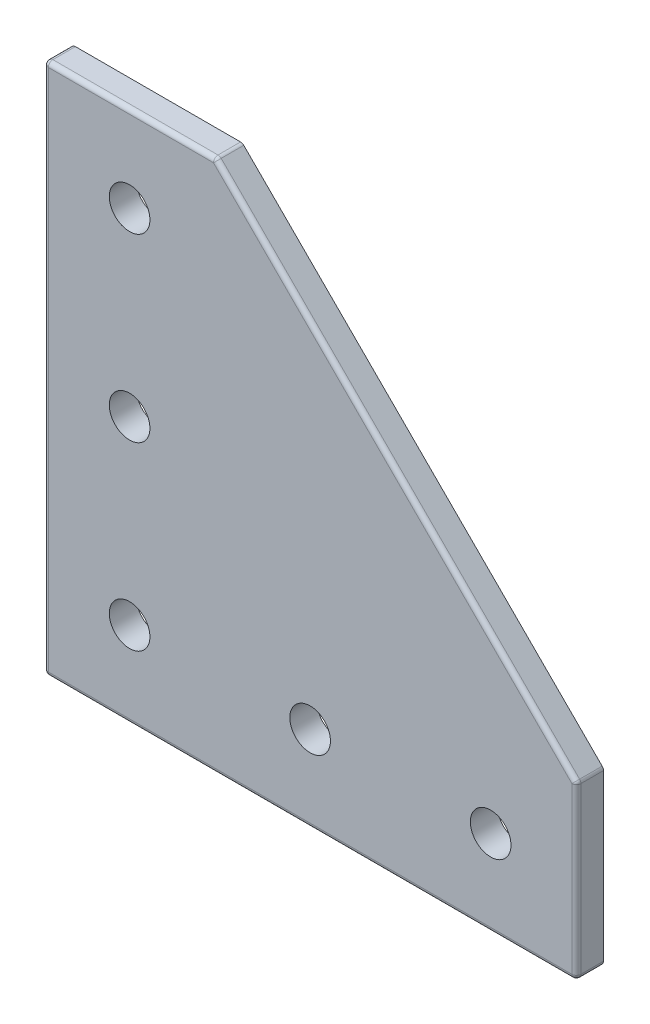
ISO-10303-21;
HEADER;
FILE_DESCRIPTION(('STEP AP214'),'2;1');
FILE_NAME('part.step','',(''),(''),'','','');
FILE_SCHEMA(('AUTOMOTIVE_DESIGN { 1 0 10303 214 1 1 1 1 }'));
ENDSEC;
DATA;
#1=APPLICATION_CONTEXT('core data for automotive mechanical design processes');
#2=APPLICATION_PROTOCOL_DEFINITION('international standard','automotive_design',2000,#1);
#3=PRODUCT_CONTEXT('',#1,'mechanical');
#4=PRODUCT('Part','Part','',(#3));
#5=PRODUCT_RELATED_PRODUCT_CATEGORY('part','',(#4));
#6=PRODUCT_DEFINITION_FORMATION('','',#4);
#7=PRODUCT_DEFINITION_CONTEXT('part definition',#1,'design');
#8=PRODUCT_DEFINITION('design','',#6,#7);
#9=PRODUCT_DEFINITION_SHAPE('','',#8);
#10=(LENGTH_UNIT() NAMED_UNIT(*) SI_UNIT(.MILLI.,.METRE.));
#11=(NAMED_UNIT(*) PLANE_ANGLE_UNIT() SI_UNIT($,.RADIAN.));
#12=(NAMED_UNIT(*) SI_UNIT($,.STERADIAN.) SOLID_ANGLE_UNIT());
#13=UNCERTAINTY_MEASURE_WITH_UNIT(LENGTH_MEASURE(1.E-05),#10,'distance_accuracy_value','');
#14=(GEOMETRIC_REPRESENTATION_CONTEXT(3) GLOBAL_UNCERTAINTY_ASSIGNED_CONTEXT((#13)) GLOBAL_UNIT_ASSIGNED_CONTEXT((#10,
#11,#12)) REPRESENTATION_CONTEXT('',''));
#15=CARTESIAN_POINT('',(0.,0.,0.));
#16=DIRECTION('',(0.,0.,1.));
#17=DIRECTION('',(1.,0.,0.));
#18=AXIS2_PLACEMENT_3D('',#15,#16,#17);
#19=CARTESIAN_POINT('',(0.,0.,3.));
#20=DIRECTION('',(0.,0.,-1.));
#21=DIRECTION('',(-1.,0.,0.));
#22=AXIS2_PLACEMENT_3D('',#19,#20,#21);
#23=PLANE('',#22);
#24=DIRECTION('',(0.,-1.,0.));
#25=VECTOR('',#24,1.);
#26=CARTESIAN_POINT('',(1.,0.,3.));
#27=LINE('',#26,#25);
#28=CARTESIAN_POINT('',(1.,117.,3.));
#29=VERTEX_POINT('',#28);
#30=CARTESIAN_POINT('',(1.,1.,3.));
#31=VERTEX_POINT('',#30);
#32=EDGE_CURVE('E305',#29,#31,#27,.T.);
#33=ORIENTED_EDGE('',*,*,#32,.T.);
#34=DIRECTION('',(1.,0.,0.));
#35=VECTOR('',#34,1.);
#36=CARTESIAN_POINT('',(0.,1.,3.));
#37=LINE('',#36,#35);
#38=CARTESIAN_POINT('',(117.,1.00000000000001,3.));
#39=VERTEX_POINT('',#38);
#40=EDGE_CURVE('E312',#31,#39,#37,.T.);
#41=ORIENTED_EDGE('',*,*,#40,.T.);
#42=DIRECTION('',(0.,1.,0.));
#43=VECTOR('',#42,1.);
#44=CARTESIAN_POINT('',(117.,0.,3.));
#45=LINE('',#44,#43);
#46=CARTESIAN_POINT('',(117.,37.5857864376269,3.));
#47=VERTEX_POINT('',#46);
#48=EDGE_CURVE('E310',#39,#47,#45,.T.);
#49=ORIENTED_EDGE('',*,*,#48,.T.);
#50=DIRECTION('',(-0.707106781186548,0.707106781186547,0.));
#51=VECTOR('',#50,1.);
#52=CARTESIAN_POINT('',(77.2928932188134,77.2928932188135,3.));
#53=LINE('',#52,#51);
#54=CARTESIAN_POINT('',(37.5857864376269,117.,3.));
#55=VERTEX_POINT('',#54);
#56=EDGE_CURVE('E307',#47,#55,#53,.T.);
#57=ORIENTED_EDGE('',*,*,#56,.T.);
#58=DIRECTION('',(-1.,0.,0.));
#59=VECTOR('',#58,1.);
#60=CARTESIAN_POINT('',(0.,117.,3.));
#61=LINE('',#60,#59);
#62=EDGE_CURVE('E303',#55,#29,#61,.T.);
#63=ORIENTED_EDGE('',*,*,#62,.T.);
#64=EDGE_LOOP('',(#33,#41,#49,#57,#63));
#65=FACE_BOUND('',#64,.T.);
#66=CARTESIAN_POINT('',(19.,59.,3.));
#67=DIRECTION('',(0.,0.,1.));
#68=DIRECTION('',(1.,0.,0.));
#69=AXIS2_PLACEMENT_3D('',#66,#67,#68);
#70=CIRCLE('',#69,4.5);
#71=CARTESIAN_POINT('',(23.5,59.,3.));
#72=VERTEX_POINT('',#71);
#73=EDGE_CURVE('E382',#72,#72,#70,.T.);
#74=ORIENTED_EDGE('',*,*,#73,.F.);
#75=EDGE_LOOP('',(#74));
#76=FACE_BOUND('',#75,.T.);
#77=CARTESIAN_POINT('',(59.,19.,3.));
#78=DIRECTION('',(0.,0.,1.));
#79=DIRECTION('',(1.,0.,0.));
#80=AXIS2_PLACEMENT_3D('',#77,#78,#79);
#81=CIRCLE('',#80,4.5);
#82=CARTESIAN_POINT('',(63.5,19.,3.));
#83=VERTEX_POINT('',#82);
#84=EDGE_CURVE('E394',#83,#83,#81,.T.);
#85=ORIENTED_EDGE('',*,*,#84,.F.);
#86=EDGE_LOOP('',(#85));
#87=FACE_BOUND('',#86,.T.);
#88=CARTESIAN_POINT('',(19.,19.,3.));
#89=DIRECTION('',(0.,0.,1.));
#90=DIRECTION('',(1.,0.,0.));
#91=AXIS2_PLACEMENT_3D('',#88,#89,#90);
#92=CIRCLE('',#91,4.5);
#93=CARTESIAN_POINT('',(23.5,19.,3.));
#94=VERTEX_POINT('',#93);
#95=EDGE_CURVE('E400',#94,#94,#92,.T.);
#96=ORIENTED_EDGE('',*,*,#95,.F.);
#97=EDGE_LOOP('',(#96));
#98=FACE_BOUND('',#97,.T.);
#99=CARTESIAN_POINT('',(99.,19.,3.));
#100=DIRECTION('',(0.,0.,1.));
#101=DIRECTION('',(1.,0.,0.));
#102=AXIS2_PLACEMENT_3D('',#99,#100,#101);
#103=CIRCLE('',#102,4.5);
#104=CARTESIAN_POINT('',(103.5,19.,3.));
#105=VERTEX_POINT('',#104);
#106=EDGE_CURVE('E388',#105,#105,#103,.T.);
#107=ORIENTED_EDGE('',*,*,#106,.F.);
#108=EDGE_LOOP('',(#107));
#109=FACE_BOUND('',#108,.T.);
#110=CARTESIAN_POINT('',(19.,99.,3.));
#111=DIRECTION('',(0.,0.,1.));
#112=DIRECTION('',(1.,0.,0.));
#113=AXIS2_PLACEMENT_3D('',#110,#111,#112);
#114=CIRCLE('',#113,4.5);
#115=CARTESIAN_POINT('',(23.5,99.,3.));
#116=VERTEX_POINT('',#115);
#117=EDGE_CURVE('E374',#116,#116,#114,.T.);
#118=ORIENTED_EDGE('',*,*,#117,.F.);
#119=EDGE_LOOP('',(#118));
#120=FACE_BOUND('',#119,.T.);
#121=ADVANCED_FACE('F162',(#65,#76,#87,#98,#109,#120),#23,.F.);
#122=CARTESIAN_POINT('',(0.,0.,-3.));
#123=DIRECTION('',(0.,0.,-1.));
#124=DIRECTION('',(-1.,0.,0.));
#125=AXIS2_PLACEMENT_3D('',#122,#123,#124);
#126=PLANE('',#125);
#127=CARTESIAN_POINT('',(19.,59.,-3.));
#128=DIRECTION('',(0.,0.,1.));
#129=DIRECTION('',(1.,0.,0.));
#130=AXIS2_PLACEMENT_3D('',#127,#128,#129);
#131=CIRCLE('',#130,4.5);
#132=CARTESIAN_POINT('',(23.5,59.,-3.));
#133=VERTEX_POINT('',#132);
#134=EDGE_CURVE('E379',#133,#133,#131,.T.);
#135=ORIENTED_EDGE('',*,*,#134,.T.);
#136=EDGE_LOOP('',(#135));
#137=FACE_BOUND('',#136,.T.);
#138=CARTESIAN_POINT('',(59.,19.,-3.));
#139=DIRECTION('',(0.,0.,1.));
#140=DIRECTION('',(1.,0.,0.));
#141=AXIS2_PLACEMENT_3D('',#138,#139,#140);
#142=CIRCLE('',#141,4.5);
#143=CARTESIAN_POINT('',(63.5,19.,-3.));
#144=VERTEX_POINT('',#143);
#145=EDGE_CURVE('E391',#144,#144,#142,.T.);
#146=ORIENTED_EDGE('',*,*,#145,.T.);
#147=EDGE_LOOP('',(#146));
#148=FACE_BOUND('',#147,.T.);
#149=DIRECTION('',(-0.707106781186548,0.707106781186547,0.));
#150=VECTOR('',#149,1.);
#151=CARTESIAN_POINT('',(38.,118.,-3.));
#152=LINE('',#151,#150);
#153=CARTESIAN_POINT('',(117.707106781187,38.2928932188135,-3.));
#154=VERTEX_POINT('',#153);
#155=CARTESIAN_POINT('',(38.2928932188134,117.707106781187,-3.));
#156=VERTEX_POINT('',#155);
#157=EDGE_CURVE('E268',#154,#156,#152,.T.);
#158=ORIENTED_EDGE('',*,*,#157,.F.);
#159=CARTESIAN_POINT('',(117.,37.5857864376269,-3.));
#160=DIRECTION('',(0.,0.,-1.));
#161=DIRECTION('',(-1.,0.,0.));
#162=AXIS2_PLACEMENT_3D('',#159,#160,#161);
#163=CIRCLE('',#162,1.);
#164=CARTESIAN_POINT('',(118.,37.5857864376269,-3.));
#165=VERTEX_POINT('',#164);
#166=EDGE_CURVE('E252',#154,#165,#163,.T.);
#167=ORIENTED_EDGE('',*,*,#166,.T.);
#168=DIRECTION('',(0.,1.,0.));
#169=VECTOR('',#168,1.);
#170=CARTESIAN_POINT('',(118.,38.,-3.));
#171=LINE('',#170,#169);
#172=CARTESIAN_POINT('',(118.,1.00000000000001,-3.));
#173=VERTEX_POINT('',#172);
#174=EDGE_CURVE('E280',#173,#165,#171,.T.);
#175=ORIENTED_EDGE('',*,*,#174,.F.);
#176=CARTESIAN_POINT('',(117.,1.00000000000001,-3.));
#177=DIRECTION('',(0.,0.,-1.));
#178=DIRECTION('',(-1.,0.,0.));
#179=AXIS2_PLACEMENT_3D('',#176,#177,#178);
#180=CIRCLE('',#179,1.);
#181=CARTESIAN_POINT('',(117.,0.,-3.));
#182=VERTEX_POINT('',#181);
#183=EDGE_CURVE('E294',#173,#182,#180,.T.);
#184=ORIENTED_EDGE('',*,*,#183,.T.);
#185=DIRECTION('',(1.,0.,0.));
#186=VECTOR('',#185,1.);
#187=CARTESIAN_POINT('',(118.,0.,-3.));
#188=LINE('',#187,#186);
#189=CARTESIAN_POINT('',(1.,0.,-3.));
#190=VERTEX_POINT('',#189);
#191=EDGE_CURVE('E285',#190,#182,#188,.T.);
#192=ORIENTED_EDGE('',*,*,#191,.F.);
#193=CARTESIAN_POINT('',(1.,1.,-3.));
#194=DIRECTION('',(0.,0.,-1.));
#195=DIRECTION('',(-1.,0.,0.));
#196=AXIS2_PLACEMENT_3D('',#193,#194,#195);
#197=CIRCLE('',#196,1.);
#198=CARTESIAN_POINT('',(0.,1.,-3.));
#199=VERTEX_POINT('',#198);
#200=EDGE_CURVE('E296',#190,#199,#197,.T.);
#201=ORIENTED_EDGE('',*,*,#200,.T.);
#202=DIRECTION('',(0.,-1.,0.));
#203=VECTOR('',#202,1.);
#204=CARTESIAN_POINT('',(0.,0.,-3.));
#205=LINE('',#204,#203);
#206=CARTESIAN_POINT('',(0.,117.,-3.));
#207=VERTEX_POINT('',#206);
#208=EDGE_CURVE('E283',#207,#199,#205,.T.);
#209=ORIENTED_EDGE('',*,*,#208,.F.);
#210=CARTESIAN_POINT('',(1.,117.,-3.));
#211=DIRECTION('',(0.,0.,-1.));
#212=DIRECTION('',(-1.,0.,0.));
#213=AXIS2_PLACEMENT_3D('',#210,#211,#212);
#214=CIRCLE('',#213,1.);
#215=CARTESIAN_POINT('',(1.,118.,-3.));
#216=VERTEX_POINT('',#215);
#217=EDGE_CURVE('E273',#207,#216,#214,.T.);
#218=ORIENTED_EDGE('',*,*,#217,.T.);
#219=DIRECTION('',(-1.,0.,0.));
#220=VECTOR('',#219,1.);
#221=CARTESIAN_POINT('',(38.,118.,-3.));
#222=LINE('',#221,#220);
#223=CARTESIAN_POINT('',(37.5857864376269,118.,-3.));
#224=VERTEX_POINT('',#223);
#225=EDGE_CURVE('E279',#224,#216,#222,.T.);
#226=ORIENTED_EDGE('',*,*,#225,.F.);
#227=CARTESIAN_POINT('',(37.5857864376269,117.,-3.));
#228=DIRECTION('',(0.,0.,-1.));
#229=DIRECTION('',(-1.,0.,0.));
#230=AXIS2_PLACEMENT_3D('',#227,#228,#229);
#231=CIRCLE('',#230,1.);
#232=EDGE_CURVE('E263',#224,#156,#231,.T.);
#233=ORIENTED_EDGE('',*,*,#232,.T.);
#234=EDGE_LOOP('',(#158,#167,#175,#184,#192,#201,#209,#218,#226,#233));
#235=FACE_BOUND('',#234,.T.);
#236=CARTESIAN_POINT('',(19.,19.,-3.));
#237=DIRECTION('',(0.,0.,1.));
#238=DIRECTION('',(1.,0.,0.));
#239=AXIS2_PLACEMENT_3D('',#236,#237,#238);
#240=CIRCLE('',#239,4.5);
#241=CARTESIAN_POINT('',(23.5,19.,-3.));
#242=VERTEX_POINT('',#241);
#243=EDGE_CURVE('E397',#242,#242,#240,.T.);
#244=ORIENTED_EDGE('',*,*,#243,.T.);
#245=EDGE_LOOP('',(#244));
#246=FACE_BOUND('',#245,.T.);
#247=CARTESIAN_POINT('',(99.,19.,-3.));
#248=DIRECTION('',(0.,0.,1.));
#249=DIRECTION('',(1.,0.,0.));
#250=AXIS2_PLACEMENT_3D('',#247,#248,#249);
#251=CIRCLE('',#250,4.5);
#252=CARTESIAN_POINT('',(103.5,19.,-3.));
#253=VERTEX_POINT('',#252);
#254=EDGE_CURVE('E385',#253,#253,#251,.T.);
#255=ORIENTED_EDGE('',*,*,#254,.T.);
#256=EDGE_LOOP('',(#255));
#257=FACE_BOUND('',#256,.T.);
#258=CARTESIAN_POINT('',(19.,99.,-3.));
#259=DIRECTION('',(0.,0.,1.));
#260=DIRECTION('',(1.,0.,0.));
#261=AXIS2_PLACEMENT_3D('',#258,#259,#260);
#262=CIRCLE('',#261,4.5);
#263=CARTESIAN_POINT('',(23.5,99.,-3.));
#264=VERTEX_POINT('',#263);
#265=EDGE_CURVE('E371',#264,#264,#262,.T.);
#266=ORIENTED_EDGE('',*,*,#265,.T.);
#267=EDGE_LOOP('',(#266));
#268=FACE_BOUND('',#267,.T.);
#269=ADVANCED_FACE('F275',(#137,#148,#235,#246,#257,#268),#126,.T.);
#270=CARTESIAN_POINT('',(118.,0.,3.));
#271=DIRECTION('',(0.,1.,0.));
#272=DIRECTION('',(-1.,0.,0.));
#273=AXIS2_PLACEMENT_3D('',#270,#271,#272);
#274=PLANE('',#273);
#275=DIRECTION('',(1.,0.,0.));
#276=VECTOR('',#275,1.);
#277=CARTESIAN_POINT('',(118.,0.,2.));
#278=LINE('',#277,#276);
#279=CARTESIAN_POINT('',(117.,0.,2.));
#280=VERTEX_POINT('',#279);
#281=CARTESIAN_POINT('',(1.,0.,2.));
#282=VERTEX_POINT('',#281);
#283=EDGE_CURVE('E322',#280,#282,#278,.F.);
#284=ORIENTED_EDGE('',*,*,#283,.T.);
#285=DIRECTION('',(0.,0.,-1.));
#286=VECTOR('',#285,1.);
#287=CARTESIAN_POINT('',(1.,0.,3.));
#288=LINE('',#287,#286);
#289=EDGE_CURVE('E324',#282,#190,#288,.T.);
#290=ORIENTED_EDGE('',*,*,#289,.T.);
#291=ORIENTED_EDGE('',*,*,#191,.T.);
#292=DIRECTION('',(0.,0.,-1.));
#293=VECTOR('',#292,1.);
#294=CARTESIAN_POINT('',(117.,0.,3.));
#295=LINE('',#294,#293);
#296=EDGE_CURVE('E320',#182,#280,#295,.F.);
#297=ORIENTED_EDGE('',*,*,#296,.T.);
#298=EDGE_LOOP('',(#284,#290,#291,#297));
#299=FACE_BOUND('',#298,.T.);
#300=ADVANCED_FACE('F408',(#299),#274,.F.);
#301=CARTESIAN_POINT('',(118.,38.,3.));
#302=DIRECTION('',(-1.,0.,0.));
#303=DIRECTION('',(0.,0.,1.));
#304=AXIS2_PLACEMENT_3D('',#301,#302,#303);
#305=PLANE('',#304);
#306=ORIENTED_EDGE('',*,*,#174,.T.);
#307=DIRECTION('',(0.,0.,-1.));
#308=VECTOR('',#307,1.);
#309=CARTESIAN_POINT('',(118.,37.5857864376269,3.));
#310=LINE('',#309,#308);
#311=CARTESIAN_POINT('',(118.,37.5857864376269,2.));
#312=VERTEX_POINT('',#311);
#313=EDGE_CURVE('E257',#165,#312,#310,.F.);
#314=ORIENTED_EDGE('',*,*,#313,.T.);
#315=DIRECTION('',(0.,1.,0.));
#316=VECTOR('',#315,1.);
#317=CARTESIAN_POINT('',(118.,38.,2.));
#318=LINE('',#317,#316);
#319=CARTESIAN_POINT('',(118.,1.00000000000001,2.));
#320=VERTEX_POINT('',#319);
#321=EDGE_CURVE('E300',#312,#320,#318,.F.);
#322=ORIENTED_EDGE('',*,*,#321,.T.);
#323=DIRECTION('',(0.,0.,-1.));
#324=VECTOR('',#323,1.);
#325=CARTESIAN_POINT('',(118.,1.00000000000001,3.));
#326=LINE('',#325,#324);
#327=EDGE_CURVE('E262',#320,#173,#326,.T.);
#328=ORIENTED_EDGE('',*,*,#327,.T.);
#329=EDGE_LOOP('',(#306,#314,#322,#328));
#330=FACE_BOUND('',#329,.T.);
#331=ADVANCED_FACE('F465',(#330),#305,.F.);
#332=CARTESIAN_POINT('',(38.,118.,3.));
#333=DIRECTION('',(-0.707106781186547,-0.707106781186548,0.));
#334=DIRECTION('',(0.707106781186548,-0.707106781186547,0.));
#335=AXIS2_PLACEMENT_3D('',#332,#333,#334);
#336=PLANE('',#335);
#337=DIRECTION('',(-0.707106781186548,0.707106781186547,0.));
#338=VECTOR('',#337,1.);
#339=CARTESIAN_POINT('',(38.,118.,2.));
#340=LINE('',#339,#338);
#341=CARTESIAN_POINT('',(38.2928932188134,117.707106781187,2.));
#342=VERTEX_POINT('',#341);
#343=CARTESIAN_POINT('',(117.707106781187,38.2928932188135,2.));
#344=VERTEX_POINT('',#343);
#345=EDGE_CURVE('E271',#342,#344,#340,.F.);
#346=ORIENTED_EDGE('',*,*,#345,.T.);
#347=DIRECTION('',(0.,0.,-1.));
#348=VECTOR('',#347,1.);
#349=CARTESIAN_POINT('',(117.707106781187,38.2928932188135,3.));
#350=LINE('',#349,#348);
#351=EDGE_CURVE('E256',#344,#154,#350,.T.);
#352=ORIENTED_EDGE('',*,*,#351,.T.);
#353=ORIENTED_EDGE('',*,*,#157,.T.);
#354=DIRECTION('',(0.,0.,-1.));
#355=VECTOR('',#354,1.);
#356=CARTESIAN_POINT('',(38.2928932188134,117.707106781187,3.));
#357=LINE('',#356,#355);
#358=EDGE_CURVE('E290',#156,#342,#357,.F.);
#359=ORIENTED_EDGE('',*,*,#358,.T.);
#360=EDGE_LOOP('',(#346,#352,#353,#359));
#361=FACE_BOUND('',#360,.T.);
#362=ADVANCED_FACE('F267',(#361),#336,.F.);
#363=CARTESIAN_POINT('',(38.,118.,3.));
#364=DIRECTION('',(0.,-1.,0.));
#365=DIRECTION('',(0.,0.,-1.));
#366=AXIS2_PLACEMENT_3D('',#363,#364,#365);
#367=PLANE('',#366);
#368=DIRECTION('',(-1.,0.,0.));
#369=VECTOR('',#368,1.);
#370=CARTESIAN_POINT('',(38.,118.,2.));
#371=LINE('',#370,#369);
#372=CARTESIAN_POINT('',(1.,118.,2.));
#373=VERTEX_POINT('',#372);
#374=CARTESIAN_POINT('',(37.5857864376269,118.,2.));
#375=VERTEX_POINT('',#374);
#376=EDGE_CURVE('E316',#373,#375,#371,.F.);
#377=ORIENTED_EDGE('',*,*,#376,.T.);
#378=DIRECTION('',(0.,0.,-1.));
#379=VECTOR('',#378,1.);
#380=CARTESIAN_POINT('',(37.5857864376269,118.,3.));
#381=LINE('',#380,#379);
#382=EDGE_CURVE('E318',#375,#224,#381,.T.);
#383=ORIENTED_EDGE('',*,*,#382,.T.);
#384=ORIENTED_EDGE('',*,*,#225,.T.);
#385=DIRECTION('',(0.,0.,-1.));
#386=VECTOR('',#385,1.);
#387=CARTESIAN_POINT('',(1.,118.,3.));
#388=LINE('',#387,#386);
#389=EDGE_CURVE('E314',#216,#373,#388,.F.);
#390=ORIENTED_EDGE('',*,*,#389,.T.);
#391=EDGE_LOOP('',(#377,#383,#384,#390));
#392=FACE_BOUND('',#391,.T.);
#393=ADVANCED_FACE('F447',(#392),#367,.F.);
#394=CARTESIAN_POINT('',(0.,0.,3.));
#395=DIRECTION('',(1.,0.,0.));
#396=DIRECTION('',(0.,0.,-1.));
#397=AXIS2_PLACEMENT_3D('',#394,#395,#396);
#398=PLANE('',#397);
#399=ORIENTED_EDGE('',*,*,#208,.T.);
#400=DIRECTION('',(0.,0.,-1.));
#401=VECTOR('',#400,1.);
#402=CARTESIAN_POINT('',(0.,1.,3.));
#403=LINE('',#402,#401);
#404=CARTESIAN_POINT('',(0.,1.,2.));
#405=VERTEX_POINT('',#404);
#406=EDGE_CURVE('E12',#199,#405,#403,.F.);
#407=ORIENTED_EDGE('',*,*,#406,.T.);
#408=DIRECTION('',(0.,-1.,0.));
#409=VECTOR('',#408,1.);
#410=CARTESIAN_POINT('',(0.,0.,2.));
#411=LINE('',#410,#409);
#412=CARTESIAN_POINT('',(0.,117.,2.));
#413=VERTEX_POINT('',#412);
#414=EDGE_CURVE('E171',#405,#413,#411,.F.);
#415=ORIENTED_EDGE('',*,*,#414,.T.);
#416=DIRECTION('',(0.,0.,-1.));
#417=VECTOR('',#416,1.);
#418=CARTESIAN_POINT('',(0.,117.,3.));
#419=LINE('',#418,#417);
#420=EDGE_CURVE('E326',#413,#207,#419,.T.);
#421=ORIENTED_EDGE('',*,*,#420,.T.);
#422=EDGE_LOOP('',(#399,#407,#415,#421));
#423=FACE_BOUND('',#422,.T.);
#424=ADVANCED_FACE('F428',(#423),#398,.F.);
#425=CARTESIAN_POINT('',(19.,19.,3.));
#426=DIRECTION('',(0.,0.,-1.));
#427=DIRECTION('',(-1.,0.,0.));
#428=AXIS2_PLACEMENT_3D('',#425,#426,#427);
#429=CYLINDRICAL_SURFACE('',#428,4.5);
#430=ORIENTED_EDGE('',*,*,#95,.T.);
#431=EDGE_LOOP('',(#430));
#432=FACE_BOUND('',#431,.T.);
#433=ORIENTED_EDGE('',*,*,#243,.F.);
#434=EDGE_LOOP('',(#433));
#435=FACE_BOUND('',#434,.T.);
#436=ADVANCED_FACE('F484',(#432,#435),#429,.F.);
#437=CARTESIAN_POINT('',(59.,19.,3.));
#438=DIRECTION('',(0.,0.,-1.));
#439=DIRECTION('',(-1.,0.,0.));
#440=AXIS2_PLACEMENT_3D('',#437,#438,#439);
#441=CYLINDRICAL_SURFACE('',#440,4.5);
#442=ORIENTED_EDGE('',*,*,#84,.T.);
#443=EDGE_LOOP('',(#442));
#444=FACE_BOUND('',#443,.T.);
#445=ORIENTED_EDGE('',*,*,#145,.F.);
#446=EDGE_LOOP('',(#445));
#447=FACE_BOUND('',#446,.T.);
#448=ADVANCED_FACE('F505',(#444,#447),#441,.F.);
#449=CARTESIAN_POINT('',(99.,19.,3.));
#450=DIRECTION('',(0.,0.,-1.));
#451=DIRECTION('',(-1.,0.,0.));
#452=AXIS2_PLACEMENT_3D('',#449,#450,#451);
#453=CYLINDRICAL_SURFACE('',#452,4.5);
#454=ORIENTED_EDGE('',*,*,#106,.T.);
#455=EDGE_LOOP('',(#454));
#456=FACE_BOUND('',#455,.T.);
#457=ORIENTED_EDGE('',*,*,#254,.F.);
#458=EDGE_LOOP('',(#457));
#459=FACE_BOUND('',#458,.T.);
#460=ADVANCED_FACE('F512',(#456,#459),#453,.F.);
#461=CARTESIAN_POINT('',(19.,59.,3.));
#462=DIRECTION('',(0.,0.,-1.));
#463=DIRECTION('',(-1.,0.,0.));
#464=AXIS2_PLACEMENT_3D('',#461,#462,#463);
#465=CYLINDRICAL_SURFACE('',#464,4.5);
#466=ORIENTED_EDGE('',*,*,#73,.T.);
#467=EDGE_LOOP('',(#466));
#468=FACE_BOUND('',#467,.T.);
#469=ORIENTED_EDGE('',*,*,#134,.F.);
#470=EDGE_LOOP('',(#469));
#471=FACE_BOUND('',#470,.T.);
#472=ADVANCED_FACE('F519',(#468,#471),#465,.F.);
#473=CARTESIAN_POINT('',(19.,99.,3.));
#474=DIRECTION('',(0.,0.,-1.));
#475=DIRECTION('',(-1.,0.,0.));
#476=AXIS2_PLACEMENT_3D('',#473,#474,#475);
#477=CYLINDRICAL_SURFACE('',#476,4.5);
#478=ORIENTED_EDGE('',*,*,#117,.T.);
#479=EDGE_LOOP('',(#478));
#480=FACE_BOUND('',#479,.T.);
#481=ORIENTED_EDGE('',*,*,#265,.F.);
#482=EDGE_LOOP('',(#481));
#483=FACE_BOUND('',#482,.T.);
#484=ADVANCED_FACE('F527',(#480,#483),#477,.F.);
#485=CARTESIAN_POINT('',(1.,1.,3.));
#486=DIRECTION('',(0.,0.,-1.));
#487=DIRECTION('',(-1.,0.,0.));
#488=AXIS2_PLACEMENT_3D('',#485,#486,#487);
#489=CYLINDRICAL_SURFACE('',#488,1.);
#490=ORIENTED_EDGE('',*,*,#200,.F.);
#491=ORIENTED_EDGE('',*,*,#289,.F.);
#492=CARTESIAN_POINT('',(1.,1.,2.));
#493=DIRECTION('',(0.,0.,1.));
#494=DIRECTION('',(1.,0.,0.));
#495=AXIS2_PLACEMENT_3D('',#492,#493,#494);
#496=CIRCLE('',#495,1.);
#497=EDGE_CURVE('E166',#405,#282,#496,.T.);
#498=ORIENTED_EDGE('',*,*,#497,.F.);
#499=ORIENTED_EDGE('',*,*,#406,.F.);
#500=EDGE_LOOP('',(#490,#491,#498,#499));
#501=FACE_BOUND('',#500,.T.);
#502=ADVANCED_FACE('F164',(#501),#489,.T.);
#503=CARTESIAN_POINT('',(1.,0.,2.));
#504=DIRECTION('',(0.,-1.,0.));
#505=DIRECTION('',(0.,0.,-1.));
#506=AXIS2_PLACEMENT_3D('',#503,#504,#505);
#507=CYLINDRICAL_SURFACE('',#506,1.);
#508=CARTESIAN_POINT('',(1.,117.,2.));
#509=DIRECTION('',(0.,1.,0.));
#510=DIRECTION('',(0.,0.,1.));
#511=AXIS2_PLACEMENT_3D('',#508,#509,#510);
#512=CIRCLE('',#511,1.);
#513=EDGE_CURVE('E363',#413,#29,#512,.T.);
#514=ORIENTED_EDGE('',*,*,#513,.F.);
#515=ORIENTED_EDGE('',*,*,#414,.F.);
#516=CARTESIAN_POINT('',(1.,1.,2.));
#517=DIRECTION('',(0.,-1.,0.));
#518=DIRECTION('',(0.,0.,-1.));
#519=AXIS2_PLACEMENT_3D('',#516,#517,#518);
#520=CIRCLE('',#519,1.);
#521=EDGE_CURVE('E365',#31,#405,#520,.T.);
#522=ORIENTED_EDGE('',*,*,#521,.F.);
#523=ORIENTED_EDGE('',*,*,#32,.F.);
#524=EDGE_LOOP('',(#514,#515,#522,#523));
#525=FACE_BOUND('',#524,.T.);
#526=ADVANCED_FACE('F437',(#525),#507,.T.);
#527=CARTESIAN_POINT('',(1.,117.,3.));
#528=DIRECTION('',(0.,0.,-1.));
#529=DIRECTION('',(-1.,0.,0.));
#530=AXIS2_PLACEMENT_3D('',#527,#528,#529);
#531=CYLINDRICAL_SURFACE('',#530,1.);
#532=ORIENTED_EDGE('',*,*,#217,.F.);
#533=ORIENTED_EDGE('',*,*,#420,.F.);
#534=CARTESIAN_POINT('',(1.,117.,2.));
#535=DIRECTION('',(0.,0.,1.));
#536=DIRECTION('',(1.,0.,0.));
#537=AXIS2_PLACEMENT_3D('',#534,#535,#536);
#538=CIRCLE('',#537,1.);
#539=EDGE_CURVE('E360',#373,#413,#538,.T.);
#540=ORIENTED_EDGE('',*,*,#539,.F.);
#541=ORIENTED_EDGE('',*,*,#389,.F.);
#542=EDGE_LOOP('',(#532,#533,#540,#541));
#543=FACE_BOUND('',#542,.T.);
#544=ADVANCED_FACE('F432',(#543),#531,.T.);
#545=CARTESIAN_POINT('',(1.,1.,2.));
#546=DIRECTION('',(0.,0.,1.));
#547=DIRECTION('',(1.,0.,0.));
#548=AXIS2_PLACEMENT_3D('',#545,#546,#547);
#549=SPHERICAL_SURFACE('',#548,1.);
#550=ORIENTED_EDGE('',*,*,#521,.T.);
#551=ORIENTED_EDGE('',*,*,#497,.T.);
#552=CARTESIAN_POINT('',(1.,1.,2.));
#553=DIRECTION('',(-1.,0.,0.));
#554=DIRECTION('',(0.,0.,1.));
#555=AXIS2_PLACEMENT_3D('',#552,#553,#554);
#556=CIRCLE('',#555,1.);
#557=EDGE_CURVE('E357',#31,#282,#556,.F.);
#558=ORIENTED_EDGE('',*,*,#557,.F.);
#559=EDGE_LOOP('',(#550,#551,#558));
#560=FACE_BOUND('',#559,.T.);
#561=ADVANCED_FACE('F551',(#560),#549,.T.);
#562=CARTESIAN_POINT('',(1.,117.,2.));
#563=DIRECTION('',(0.,0.,1.));
#564=DIRECTION('',(1.,0.,0.));
#565=AXIS2_PLACEMENT_3D('',#562,#563,#564);
#566=SPHERICAL_SURFACE('',#565,1.);
#567=ORIENTED_EDGE('',*,*,#539,.T.);
#568=ORIENTED_EDGE('',*,*,#513,.T.);
#569=CARTESIAN_POINT('',(1.,117.,2.));
#570=DIRECTION('',(-1.,0.,0.));
#571=DIRECTION('',(0.,0.,1.));
#572=AXIS2_PLACEMENT_3D('',#569,#570,#571);
#573=CIRCLE('',#572,1.);
#574=EDGE_CURVE('E354',#373,#29,#573,.F.);
#575=ORIENTED_EDGE('',*,*,#574,.F.);
#576=EDGE_LOOP('',(#567,#568,#575));
#577=FACE_BOUND('',#576,.T.);
#578=ADVANCED_FACE('F439',(#577),#566,.T.);
#579=CARTESIAN_POINT('',(117.,1.00000000000001,3.));
#580=DIRECTION('',(0.,0.,-1.));
#581=DIRECTION('',(-1.,0.,0.));
#582=AXIS2_PLACEMENT_3D('',#579,#580,#581);
#583=CYLINDRICAL_SURFACE('',#582,1.);
#584=ORIENTED_EDGE('',*,*,#183,.F.);
#585=ORIENTED_EDGE('',*,*,#327,.F.);
#586=CARTESIAN_POINT('',(117.,1.00000000000001,2.));
#587=DIRECTION('',(0.,0.,1.));
#588=DIRECTION('',(1.,0.,0.));
#589=AXIS2_PLACEMENT_3D('',#586,#587,#588);
#590=CIRCLE('',#589,1.);
#591=EDGE_CURVE('E351',#280,#320,#590,.T.);
#592=ORIENTED_EDGE('',*,*,#591,.F.);
#593=ORIENTED_EDGE('',*,*,#296,.F.);
#594=EDGE_LOOP('',(#584,#585,#592,#593));
#595=FACE_BOUND('',#594,.T.);
#596=ADVANCED_FACE('F415',(#595),#583,.T.);
#597=CARTESIAN_POINT('',(0.,1.,2.));
#598=DIRECTION('',(1.,0.,0.));
#599=DIRECTION('',(0.,1.,0.));
#600=AXIS2_PLACEMENT_3D('',#597,#598,#599);
#601=CYLINDRICAL_SURFACE('',#600,1.);
#602=ORIENTED_EDGE('',*,*,#557,.T.);
#603=ORIENTED_EDGE('',*,*,#283,.F.);
#604=CARTESIAN_POINT('',(117.,1.00000000000001,2.));
#605=DIRECTION('',(1.,0.,0.));
#606=DIRECTION('',(0.,0.,-1.));
#607=AXIS2_PLACEMENT_3D('',#604,#605,#606);
#608=CIRCLE('',#607,1.);
#609=EDGE_CURVE('E348',#39,#280,#608,.T.);
#610=ORIENTED_EDGE('',*,*,#609,.F.);
#611=ORIENTED_EDGE('',*,*,#40,.F.);
#612=EDGE_LOOP('',(#602,#603,#610,#611));
#613=FACE_BOUND('',#612,.T.);
#614=ADVANCED_FACE('F424',(#613),#601,.T.);
#615=CARTESIAN_POINT('',(0.,117.,2.));
#616=DIRECTION('',(-1.,0.,0.));
#617=DIRECTION('',(0.,0.,1.));
#618=AXIS2_PLACEMENT_3D('',#615,#616,#617);
#619=CYLINDRICAL_SURFACE('',#618,1.);
#620=ORIENTED_EDGE('',*,*,#574,.T.);
#621=ORIENTED_EDGE('',*,*,#62,.F.);
#622=CARTESIAN_POINT('',(37.5857864376269,117.,2.));
#623=DIRECTION('',(1.,0.,0.));
#624=DIRECTION('',(0.,0.,-1.));
#625=AXIS2_PLACEMENT_3D('',#622,#623,#624);
#626=CIRCLE('',#625,1.);
#627=EDGE_CURVE('E345',#375,#55,#626,.T.);
#628=ORIENTED_EDGE('',*,*,#627,.F.);
#629=ORIENTED_EDGE('',*,*,#376,.F.);
#630=EDGE_LOOP('',(#620,#621,#628,#629));
#631=FACE_BOUND('',#630,.T.);
#632=ADVANCED_FACE('F444',(#631),#619,.T.);
#633=CARTESIAN_POINT('',(37.5857864376269,117.,3.));
#634=DIRECTION('',(0.,0.,-1.));
#635=DIRECTION('',(-1.,0.,0.));
#636=AXIS2_PLACEMENT_3D('',#633,#634,#635);
#637=CYLINDRICAL_SURFACE('',#636,1.);
#638=ORIENTED_EDGE('',*,*,#232,.F.);
#639=ORIENTED_EDGE('',*,*,#382,.F.);
#640=CARTESIAN_POINT('',(37.5857864376269,117.,2.));
#641=DIRECTION('',(0.,0.,1.));
#642=DIRECTION('',(1.,0.,0.));
#643=AXIS2_PLACEMENT_3D('',#640,#641,#642);
#644=CIRCLE('',#643,1.);
#645=EDGE_CURVE('E342',#342,#375,#644,.T.);
#646=ORIENTED_EDGE('',*,*,#645,.F.);
#647=ORIENTED_EDGE('',*,*,#358,.F.);
#648=EDGE_LOOP('',(#638,#639,#646,#647));
#649=FACE_BOUND('',#648,.T.);
#650=ADVANCED_FACE('F450',(#649),#637,.T.);
#651=CARTESIAN_POINT('',(117.,1.00000000000001,2.));
#652=DIRECTION('',(0.,0.,1.));
#653=DIRECTION('',(1.,0.,0.));
#654=AXIS2_PLACEMENT_3D('',#651,#652,#653);
#655=SPHERICAL_SURFACE('',#654,1.);
#656=ORIENTED_EDGE('',*,*,#609,.T.);
#657=ORIENTED_EDGE('',*,*,#591,.T.);
#658=CARTESIAN_POINT('',(117.,1.00000000000001,2.));
#659=DIRECTION('',(0.,-1.,0.));
#660=DIRECTION('',(0.,0.,-1.));
#661=AXIS2_PLACEMENT_3D('',#658,#659,#660);
#662=CIRCLE('',#661,1.);
#663=EDGE_CURVE('E339',#39,#320,#662,.F.);
#664=ORIENTED_EDGE('',*,*,#663,.F.);
#665=EDGE_LOOP('',(#656,#657,#664));
#666=FACE_BOUND('',#665,.T.);
#667=ADVANCED_FACE('F420',(#666),#655,.T.);
#668=CARTESIAN_POINT('',(37.5857864376269,117.,2.));
#669=DIRECTION('',(0.,0.,1.));
#670=DIRECTION('',(1.,0.,0.));
#671=AXIS2_PLACEMENT_3D('',#668,#669,#670);
#672=SPHERICAL_SURFACE('',#671,1.);
#673=ORIENTED_EDGE('',*,*,#645,.T.);
#674=ORIENTED_EDGE('',*,*,#627,.T.);
#675=CARTESIAN_POINT('',(37.5857864376269,117.,2.));
#676=DIRECTION('',(-0.707106781186544,0.707106781186551,0.));
#677=DIRECTION('',(-0.707106781186551,-0.707106781186544,0.));
#678=AXIS2_PLACEMENT_3D('',#675,#676,#677);
#679=CIRCLE('',#678,1.);
#680=EDGE_CURVE('E337',#342,#55,#679,.F.);
#681=ORIENTED_EDGE('',*,*,#680,.F.);
#682=EDGE_LOOP('',(#673,#674,#681));
#683=FACE_BOUND('',#682,.T.);
#684=ADVANCED_FACE('F453',(#683),#672,.T.);
#685=CARTESIAN_POINT('',(117.,0.,2.));
#686=DIRECTION('',(0.,1.,0.));
#687=DIRECTION('',(0.,0.,1.));
#688=AXIS2_PLACEMENT_3D('',#685,#686,#687);
#689=CYLINDRICAL_SURFACE('',#688,1.);
#690=ORIENTED_EDGE('',*,*,#663,.T.);
#691=ORIENTED_EDGE('',*,*,#321,.F.);
#692=CARTESIAN_POINT('',(117.,37.5857864376269,2.));
#693=DIRECTION('',(0.,1.,0.));
#694=DIRECTION('',(-1.,0.,0.));
#695=AXIS2_PLACEMENT_3D('',#692,#693,#694);
#696=CIRCLE('',#695,1.);
#697=EDGE_CURVE('E334',#47,#312,#696,.T.);
#698=ORIENTED_EDGE('',*,*,#697,.F.);
#699=ORIENTED_EDGE('',*,*,#48,.F.);
#700=EDGE_LOOP('',(#690,#691,#698,#699));
#701=FACE_BOUND('',#700,.T.);
#702=ADVANCED_FACE('F463',(#701),#689,.T.);
#703=CARTESIAN_POINT('',(77.2928932188134,77.2928932188135,2.));
#704=DIRECTION('',(-0.707106781186548,0.707106781186547,0.));
#705=DIRECTION('',(-0.707106781186547,-0.707106781186548,0.));
#706=AXIS2_PLACEMENT_3D('',#703,#704,#705);
#707=CYLINDRICAL_SURFACE('',#706,1.);
#708=ORIENTED_EDGE('',*,*,#680,.T.);
#709=ORIENTED_EDGE('',*,*,#56,.F.);
#710=CARTESIAN_POINT('',(117.,37.5857864376269,2.));
#711=DIRECTION('',(0.707106781186548,-0.707106781186548,0.));
#712=DIRECTION('',(0.707106781186548,0.707106781186548,0.));
#713=AXIS2_PLACEMENT_3D('',#710,#711,#712);
#714=CIRCLE('',#713,1.);
#715=EDGE_CURVE('E331',#344,#47,#714,.T.);
#716=ORIENTED_EDGE('',*,*,#715,.F.);
#717=ORIENTED_EDGE('',*,*,#345,.F.);
#718=EDGE_LOOP('',(#708,#709,#716,#717));
#719=FACE_BOUND('',#718,.T.);
#720=ADVANCED_FACE('F456',(#719),#707,.T.);
#721=CARTESIAN_POINT('',(117.,37.5857864376269,2.));
#722=DIRECTION('',(0.,0.,1.));
#723=DIRECTION('',(1.,0.,0.));
#724=AXIS2_PLACEMENT_3D('',#721,#722,#723);
#725=SPHERICAL_SURFACE('',#724,1.);
#726=ORIENTED_EDGE('',*,*,#715,.T.);
#727=ORIENTED_EDGE('',*,*,#697,.T.);
#728=CARTESIAN_POINT('',(117.,37.5857864376269,2.));
#729=DIRECTION('',(0.,0.,1.));
#730=DIRECTION('',(1.,0.,0.));
#731=AXIS2_PLACEMENT_3D('',#728,#729,#730);
#732=CIRCLE('',#731,1.);
#733=EDGE_CURVE('E329',#344,#312,#732,.F.);
#734=ORIENTED_EDGE('',*,*,#733,.F.);
#735=EDGE_LOOP('',(#726,#727,#734));
#736=FACE_BOUND('',#735,.T.);
#737=ADVANCED_FACE('F460',(#736),#725,.T.);
#738=CARTESIAN_POINT('',(117.,37.5857864376269,3.));
#739=DIRECTION('',(0.,0.,-1.));
#740=DIRECTION('',(-1.,0.,0.));
#741=AXIS2_PLACEMENT_3D('',#738,#739,#740);
#742=CYLINDRICAL_SURFACE('',#741,1.);
#743=ORIENTED_EDGE('',*,*,#733,.T.);
#744=ORIENTED_EDGE('',*,*,#313,.F.);
#745=ORIENTED_EDGE('',*,*,#166,.F.);
#746=ORIENTED_EDGE('',*,*,#351,.F.);
#747=EDGE_LOOP('',(#743,#744,#745,#746));
#748=FACE_BOUND('',#747,.T.);
#749=ADVANCED_FACE('F255',(#748),#742,.T.);
#750=CLOSED_SHELL('',(#121,#269,#300,#331,#362,#393,#424,#436,#448,#460,#472,#484,#502,#526,
#544,#561,#578,#596,#614,#632,#650,#667,#684,#702,#720,#737,#749));
#751=MANIFOLD_SOLID_BREP('B2',#750);
#752=ADVANCED_BREP_SHAPE_REPRESENTATION('',(#18,#751),#14);
#753=SHAPE_DEFINITION_REPRESENTATION(#9,#752);
ENDSEC;
END-ISO-10303-21;
